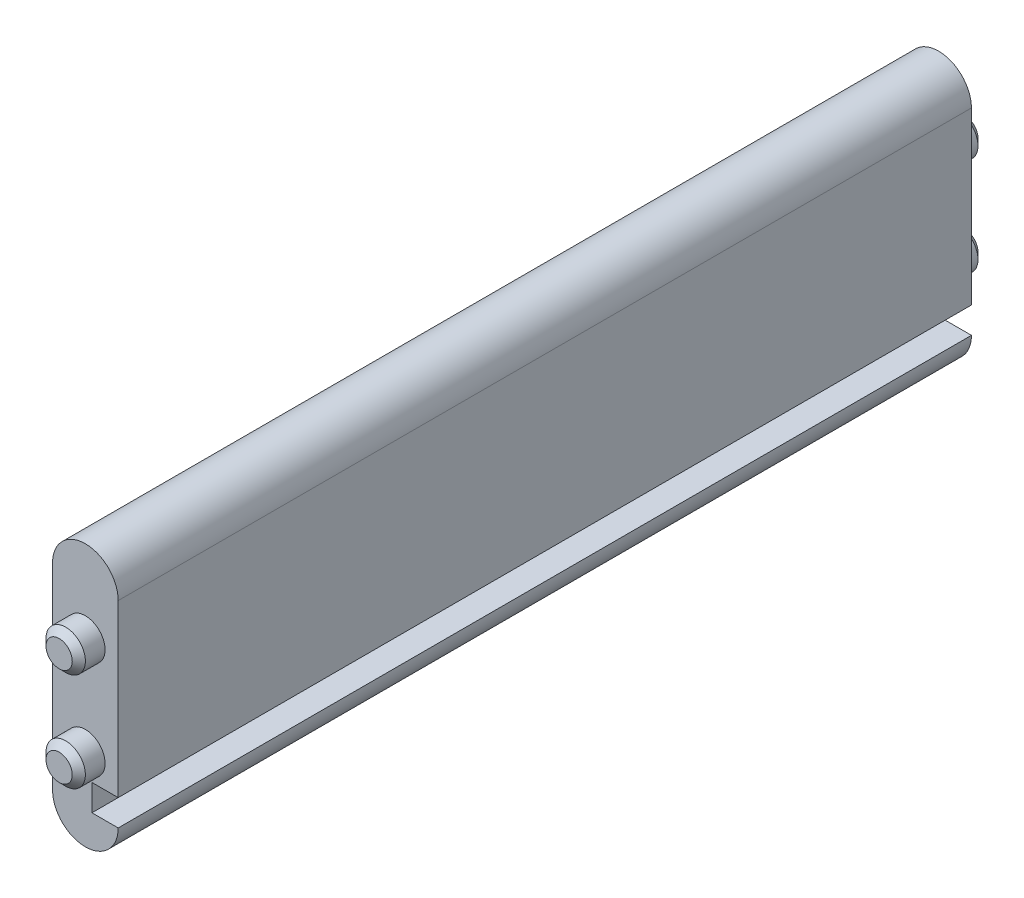
ISO-10303-21;
HEADER;
FILE_DESCRIPTION(('STEP AP214'),'2;1');
FILE_NAME('part.step','',(''),(''),'','','');
FILE_SCHEMA(('AUTOMOTIVE_DESIGN { 1 0 10303 214 1 1 1 1 }'));
ENDSEC;
DATA;
#1=APPLICATION_CONTEXT('core data for automotive mechanical design processes');
#2=APPLICATION_PROTOCOL_DEFINITION('international standard','automotive_design',2000,#1);
#3=PRODUCT_CONTEXT('',#1,'mechanical');
#4=PRODUCT('Part','Part','',(#3));
#5=PRODUCT_RELATED_PRODUCT_CATEGORY('part','',(#4));
#6=PRODUCT_DEFINITION_FORMATION('','',#4);
#7=PRODUCT_DEFINITION_CONTEXT('part definition',#1,'design');
#8=PRODUCT_DEFINITION('design','',#6,#7);
#9=PRODUCT_DEFINITION_SHAPE('','',#8);
#10=(LENGTH_UNIT() NAMED_UNIT(*) SI_UNIT(.MILLI.,.METRE.));
#11=(NAMED_UNIT(*) PLANE_ANGLE_UNIT() SI_UNIT($,.RADIAN.));
#12=(NAMED_UNIT(*) SI_UNIT($,.STERADIAN.) SOLID_ANGLE_UNIT());
#13=UNCERTAINTY_MEASURE_WITH_UNIT(LENGTH_MEASURE(1.E-05),#10,'distance_accuracy_value','');
#14=(GEOMETRIC_REPRESENTATION_CONTEXT(3) GLOBAL_UNCERTAINTY_ASSIGNED_CONTEXT((#13)) GLOBAL_UNIT_ASSIGNED_CONTEXT((#10,
#11,#12)) REPRESENTATION_CONTEXT('',''));
#15=CARTESIAN_POINT('',(0.,0.,0.));
#16=DIRECTION('',(0.,0.,1.));
#17=DIRECTION('',(1.,0.,0.));
#18=AXIS2_PLACEMENT_3D('',#15,#16,#17);
#19=CARTESIAN_POINT('',(0.,15.,65.));
#20=DIRECTION('',(0.,0.,-1.));
#21=DIRECTION('',(-1.,0.,0.));
#22=AXIS2_PLACEMENT_3D('',#19,#20,#21);
#23=PLANE('',#22);
#24=CARTESIAN_POINT('',(0.,7.5,65.));
#25=DIRECTION('',(0.,0.,-1.));
#26=DIRECTION('',(-1.,0.,0.));
#27=AXIS2_PLACEMENT_3D('',#24,#25,#26);
#28=CIRCLE('',#27,3.);
#29=CARTESIAN_POINT('',(-3.,7.5,65.));
#30=VERTEX_POINT('',#29);
#31=EDGE_CURVE('E146',#30,#30,#28,.F.);
#32=ORIENTED_EDGE('',*,*,#31,.F.);
#33=EDGE_LOOP('',(#32));
#34=FACE_BOUND('',#33,.T.);
#35=CARTESIAN_POINT('',(0.,15.,65.));
#36=DIRECTION('',(0.,0.,1.));
#37=DIRECTION('',(-1.,0.,0.));
#38=AXIS2_PLACEMENT_3D('',#35,#36,#37);
#39=CIRCLE('',#38,5.);
#40=CARTESIAN_POINT('',(5.,15.,65.));
#41=VERTEX_POINT('',#40);
#42=CARTESIAN_POINT('',(-5.,15.,65.));
#43=VERTEX_POINT('',#42);
#44=EDGE_CURVE('E134',#41,#43,#39,.T.);
#45=ORIENTED_EDGE('',*,*,#44,.T.);
#46=DIRECTION('',(0.,-1.,0.));
#47=VECTOR('',#46,1.);
#48=CARTESIAN_POINT('',(-5.,15.,65.));
#49=LINE('',#48,#47);
#50=CARTESIAN_POINT('',(-4.99999999999999,-15.,65.));
#51=VERTEX_POINT('',#50);
#52=EDGE_CURVE('E88',#43,#51,#49,.T.);
#53=ORIENTED_EDGE('',*,*,#52,.T.);
#54=CARTESIAN_POINT('',(0.,-15.,65.));
#55=DIRECTION('',(0.,0.,1.));
#56=DIRECTION('',(1.,0.,0.));
#57=AXIS2_PLACEMENT_3D('',#54,#55,#56);
#58=CIRCLE('',#57,5.);
#59=CARTESIAN_POINT('',(4.99999999999999,-15.,65.));
#60=VERTEX_POINT('',#59);
#61=EDGE_CURVE('E281',#51,#60,#58,.T.);
#62=ORIENTED_EDGE('',*,*,#61,.T.);
#63=DIRECTION('',(-1.,0.,0.));
#64=VECTOR('',#63,1.);
#65=CARTESIAN_POINT('',(5.00000000000001,-15.,65.));
#66=LINE('',#65,#64);
#67=CARTESIAN_POINT('',(0.999999999999997,-15.,65.));
#68=VERTEX_POINT('',#67);
#69=EDGE_CURVE('E104',#60,#68,#66,.T.);
#70=ORIENTED_EDGE('',*,*,#69,.T.);
#71=DIRECTION('',(0.,1.,0.));
#72=VECTOR('',#71,1.);
#73=CARTESIAN_POINT('',(0.999999999999997,-15.,65.));
#74=LINE('',#73,#72);
#75=CARTESIAN_POINT('',(0.999999999999997,-11.,65.));
#76=VERTEX_POINT('',#75);
#77=EDGE_CURVE('E98',#68,#76,#74,.T.);
#78=ORIENTED_EDGE('',*,*,#77,.T.);
#79=DIRECTION('',(1.,0.,0.));
#80=VECTOR('',#79,1.);
#81=CARTESIAN_POINT('',(5.,-11.,65.));
#82=LINE('',#81,#80);
#83=CARTESIAN_POINT('',(5.,-11.,65.));
#84=VERTEX_POINT('',#83);
#85=EDGE_CURVE('E102',#76,#84,#82,.T.);
#86=ORIENTED_EDGE('',*,*,#85,.T.);
#87=DIRECTION('',(0.,1.,0.));
#88=VECTOR('',#87,1.);
#89=CARTESIAN_POINT('',(5.,15.,65.));
#90=LINE('',#89,#88);
#91=EDGE_CURVE('E47',#84,#41,#90,.T.);
#92=ORIENTED_EDGE('',*,*,#91,.T.);
#93=EDGE_LOOP('',(#45,#53,#62,#70,#78,#86,#92));
#94=FACE_BOUND('',#93,.T.);
#95=CARTESIAN_POINT('',(0.,-7.5,65.));
#96=DIRECTION('',(0.,0.,-1.));
#97=DIRECTION('',(-1.,0.,0.));
#98=AXIS2_PLACEMENT_3D('',#95,#96,#97);
#99=CIRCLE('',#98,3.);
#100=CARTESIAN_POINT('',(-3.,-7.5,65.));
#101=VERTEX_POINT('',#100);
#102=EDGE_CURVE('E149',#101,#101,#99,.F.);
#103=ORIENTED_EDGE('',*,*,#102,.F.);
#104=EDGE_LOOP('',(#103));
#105=FACE_BOUND('',#104,.T.);
#106=ADVANCED_FACE('F30',(#34,#94,#105),#23,.F.);
#107=CARTESIAN_POINT('',(0.,15.,65.));
#108=DIRECTION('',(0.,0.,-1.));
#109=DIRECTION('',(-1.,0.,0.));
#110=AXIS2_PLACEMENT_3D('',#107,#108,#109);
#111=CYLINDRICAL_SURFACE('',#110,5.);
#112=CARTESIAN_POINT('',(0.,15.,-65.));
#113=DIRECTION('',(0.,0.,1.));
#114=DIRECTION('',(-1.,0.,0.));
#115=AXIS2_PLACEMENT_3D('',#112,#113,#114);
#116=CIRCLE('',#115,5.);
#117=CARTESIAN_POINT('',(5.,15.,-65.));
#118=VERTEX_POINT('',#117);
#119=CARTESIAN_POINT('',(-5.,15.,-65.));
#120=VERTEX_POINT('',#119);
#121=EDGE_CURVE('E122',#118,#120,#116,.T.);
#122=ORIENTED_EDGE('',*,*,#121,.T.);
#123=DIRECTION('',(0.,0.,-1.));
#124=VECTOR('',#123,1.);
#125=CARTESIAN_POINT('',(-5.,15.,65.));
#126=LINE('',#125,#124);
#127=EDGE_CURVE('E144',#43,#120,#126,.T.);
#128=ORIENTED_EDGE('',*,*,#127,.F.);
#129=ORIENTED_EDGE('',*,*,#44,.F.);
#130=DIRECTION('',(0.,0.,-1.));
#131=VECTOR('',#130,1.);
#132=CARTESIAN_POINT('',(5.,15.,65.));
#133=LINE('',#132,#131);
#134=EDGE_CURVE('E118',#41,#118,#133,.T.);
#135=ORIENTED_EDGE('',*,*,#134,.T.);
#136=EDGE_LOOP('',(#122,#128,#129,#135));
#137=FACE_BOUND('',#136,.T.);
#138=ADVANCED_FACE('F191',(#137),#111,.T.);
#139=CARTESIAN_POINT('',(-5.,15.,65.));
#140=DIRECTION('',(1.,0.,0.));
#141=DIRECTION('',(0.,1.,0.));
#142=AXIS2_PLACEMENT_3D('',#139,#140,#141);
#143=PLANE('',#142);
#144=DIRECTION('',(0.,-1.,0.));
#145=VECTOR('',#144,1.);
#146=CARTESIAN_POINT('',(-5.,15.,-65.));
#147=LINE('',#146,#145);
#148=CARTESIAN_POINT('',(-4.99999999999999,-15.,-65.));
#149=VERTEX_POINT('',#148);
#150=EDGE_CURVE('E125',#120,#149,#147,.T.);
#151=ORIENTED_EDGE('',*,*,#150,.T.);
#152=DIRECTION('',(0.,0.,-1.));
#153=VECTOR('',#152,1.);
#154=CARTESIAN_POINT('',(-4.99999999999999,-15.,65.));
#155=LINE('',#154,#153);
#156=EDGE_CURVE('E141',#51,#149,#155,.T.);
#157=ORIENTED_EDGE('',*,*,#156,.F.);
#158=ORIENTED_EDGE('',*,*,#52,.F.);
#159=ORIENTED_EDGE('',*,*,#127,.T.);
#160=EDGE_LOOP('',(#151,#157,#158,#159));
#161=FACE_BOUND('',#160,.T.);
#162=ADVANCED_FACE('F197',(#161),#143,.F.);
#163=CARTESIAN_POINT('',(0.,-15.,65.));
#164=DIRECTION('',(0.,0.,-1.));
#165=DIRECTION('',(-1.,0.,0.));
#166=AXIS2_PLACEMENT_3D('',#163,#164,#165);
#167=CYLINDRICAL_SURFACE('',#166,5.);
#168=CARTESIAN_POINT('',(0.,-15.,-65.));
#169=DIRECTION('',(0.,0.,1.));
#170=DIRECTION('',(1.,0.,0.));
#171=AXIS2_PLACEMENT_3D('',#168,#169,#170);
#172=CIRCLE('',#171,5.);
#173=CARTESIAN_POINT('',(4.99999999999999,-15.,-65.));
#174=VERTEX_POINT('',#173);
#175=EDGE_CURVE('E127',#149,#174,#172,.T.);
#176=ORIENTED_EDGE('',*,*,#175,.T.);
#177=DIRECTION('',(0.,0.,-1.));
#178=VECTOR('',#177,1.);
#179=CARTESIAN_POINT('',(4.99999999999999,-15.,65.));
#180=LINE('',#179,#178);
#181=EDGE_CURVE('E138',#60,#174,#180,.T.);
#182=ORIENTED_EDGE('',*,*,#181,.F.);
#183=ORIENTED_EDGE('',*,*,#61,.F.);
#184=ORIENTED_EDGE('',*,*,#156,.T.);
#185=EDGE_LOOP('',(#176,#182,#183,#184));
#186=FACE_BOUND('',#185,.T.);
#187=ADVANCED_FACE('F219',(#186),#167,.T.);
#188=CARTESIAN_POINT('',(5.00000000000001,-15.,65.));
#189=DIRECTION('',(0.,-1.,0.));
#190=DIRECTION('',(0.,0.,-1.));
#191=AXIS2_PLACEMENT_3D('',#188,#189,#190);
#192=PLANE('',#191);
#193=DIRECTION('',(-1.,0.,0.));
#194=VECTOR('',#193,1.);
#195=CARTESIAN_POINT('',(5.00000000000001,-15.,-65.));
#196=LINE('',#195,#194);
#197=CARTESIAN_POINT('',(0.999999999999997,-15.,-65.));
#198=VERTEX_POINT('',#197);
#199=EDGE_CURVE('E129',#174,#198,#196,.T.);
#200=ORIENTED_EDGE('',*,*,#199,.T.);
#201=DIRECTION('',(0.,0.,-1.));
#202=VECTOR('',#201,1.);
#203=CARTESIAN_POINT('',(0.999999999999997,-15.,65.));
#204=LINE('',#203,#202);
#205=EDGE_CURVE('E113',#68,#198,#204,.T.);
#206=ORIENTED_EDGE('',*,*,#205,.F.);
#207=ORIENTED_EDGE('',*,*,#69,.F.);
#208=ORIENTED_EDGE('',*,*,#181,.T.);
#209=EDGE_LOOP('',(#200,#206,#207,#208));
#210=FACE_BOUND('',#209,.T.);
#211=ADVANCED_FACE('F216',(#210),#192,.F.);
#212=CARTESIAN_POINT('',(0.999999999999997,-15.,65.));
#213=DIRECTION('',(-1.,0.,0.));
#214=DIRECTION('',(0.,0.,1.));
#215=AXIS2_PLACEMENT_3D('',#212,#213,#214);
#216=PLANE('',#215);
#217=DIRECTION('',(0.,1.,0.));
#218=VECTOR('',#217,1.);
#219=CARTESIAN_POINT('',(0.999999999999997,-15.,-65.));
#220=LINE('',#219,#218);
#221=CARTESIAN_POINT('',(0.999999999999997,-11.,-65.));
#222=VERTEX_POINT('',#221);
#223=EDGE_CURVE('E112',#198,#222,#220,.T.);
#224=ORIENTED_EDGE('',*,*,#223,.T.);
#225=DIRECTION('',(0.,0.,-1.));
#226=VECTOR('',#225,1.);
#227=CARTESIAN_POINT('',(0.999999999999997,-11.,65.));
#228=LINE('',#227,#226);
#229=EDGE_CURVE('E109',#76,#222,#228,.T.);
#230=ORIENTED_EDGE('',*,*,#229,.F.);
#231=ORIENTED_EDGE('',*,*,#77,.F.);
#232=ORIENTED_EDGE('',*,*,#205,.T.);
#233=EDGE_LOOP('',(#224,#230,#231,#232));
#234=FACE_BOUND('',#233,.T.);
#235=ADVANCED_FACE('F110',(#234),#216,.F.);
#236=CARTESIAN_POINT('',(5.,-11.,65.));
#237=DIRECTION('',(0.,1.,0.));
#238=DIRECTION('',(0.,0.,1.));
#239=AXIS2_PLACEMENT_3D('',#236,#237,#238);
#240=PLANE('',#239);
#241=DIRECTION('',(1.,0.,0.));
#242=VECTOR('',#241,1.);
#243=CARTESIAN_POINT('',(5.,-11.,-65.));
#244=LINE('',#243,#242);
#245=CARTESIAN_POINT('',(5.,-11.,-65.));
#246=VERTEX_POINT('',#245);
#247=EDGE_CURVE('E73',#222,#246,#244,.T.);
#248=ORIENTED_EDGE('',*,*,#247,.T.);
#249=DIRECTION('',(0.,0.,-1.));
#250=VECTOR('',#249,1.);
#251=CARTESIAN_POINT('',(5.,-11.,65.));
#252=LINE('',#251,#250);
#253=EDGE_CURVE('E114',#84,#246,#252,.T.);
#254=ORIENTED_EDGE('',*,*,#253,.F.);
#255=ORIENTED_EDGE('',*,*,#85,.F.);
#256=ORIENTED_EDGE('',*,*,#229,.T.);
#257=EDGE_LOOP('',(#248,#254,#255,#256));
#258=FACE_BOUND('',#257,.T.);
#259=ADVANCED_FACE('F116',(#258),#240,.F.);
#260=CARTESIAN_POINT('',(5.,15.,65.));
#261=DIRECTION('',(-1.,0.,0.));
#262=DIRECTION('',(0.,-1.,0.));
#263=AXIS2_PLACEMENT_3D('',#260,#261,#262);
#264=PLANE('',#263);
#265=DIRECTION('',(0.,1.,0.));
#266=VECTOR('',#265,1.);
#267=CARTESIAN_POINT('',(5.,15.,-65.));
#268=LINE('',#267,#266);
#269=EDGE_CURVE('E79',#246,#118,#268,.T.);
#270=ORIENTED_EDGE('',*,*,#269,.T.);
#271=ORIENTED_EDGE('',*,*,#134,.F.);
#272=ORIENTED_EDGE('',*,*,#91,.F.);
#273=ORIENTED_EDGE('',*,*,#253,.T.);
#274=EDGE_LOOP('',(#270,#271,#272,#273));
#275=FACE_BOUND('',#274,.T.);
#276=ADVANCED_FACE('F208',(#275),#264,.F.);
#277=CARTESIAN_POINT('',(0.,15.,-65.));
#278=DIRECTION('',(0.,0.,-1.));
#279=DIRECTION('',(-1.,0.,0.));
#280=AXIS2_PLACEMENT_3D('',#277,#278,#279);
#281=PLANE('',#280);
#282=CARTESIAN_POINT('',(0.,-7.5,-65.));
#283=DIRECTION('',(0.,0.,-1.));
#284=DIRECTION('',(-1.,0.,0.));
#285=AXIS2_PLACEMENT_3D('',#282,#283,#284);
#286=CIRCLE('',#285,3.);
#287=CARTESIAN_POINT('',(-3.,-7.5,-65.));
#288=VERTEX_POINT('',#287);
#289=EDGE_CURVE('E167',#288,#288,#286,.T.);
#290=ORIENTED_EDGE('',*,*,#289,.F.);
#291=EDGE_LOOP('',(#290));
#292=FACE_BOUND('',#291,.T.);
#293=CARTESIAN_POINT('',(0.,7.5,-65.));
#294=DIRECTION('',(0.,0.,-1.));
#295=DIRECTION('',(-1.,0.,0.));
#296=AXIS2_PLACEMENT_3D('',#293,#294,#295);
#297=CIRCLE('',#296,3.);
#298=CARTESIAN_POINT('',(-3.,7.5,-65.));
#299=VERTEX_POINT('',#298);
#300=EDGE_CURVE('E164',#299,#299,#297,.T.);
#301=ORIENTED_EDGE('',*,*,#300,.F.);
#302=EDGE_LOOP('',(#301));
#303=FACE_BOUND('',#302,.T.);
#304=ORIENTED_EDGE('',*,*,#121,.F.);
#305=ORIENTED_EDGE('',*,*,#269,.F.);
#306=ORIENTED_EDGE('',*,*,#247,.F.);
#307=ORIENTED_EDGE('',*,*,#223,.F.);
#308=ORIENTED_EDGE('',*,*,#199,.F.);
#309=ORIENTED_EDGE('',*,*,#175,.F.);
#310=ORIENTED_EDGE('',*,*,#150,.F.);
#311=EDGE_LOOP('',(#304,#305,#306,#307,#308,#309,#310));
#312=FACE_BOUND('',#311,.T.);
#313=ADVANCED_FACE('F205',(#292,#303,#312),#281,.T.);
#314=CARTESIAN_POINT('',(0.,7.5,69.));
#315=DIRECTION('',(0.,0.,-1.));
#316=DIRECTION('',(-1.,0.,0.));
#317=AXIS2_PLACEMENT_3D('',#314,#315,#316);
#318=CYLINDRICAL_SURFACE('',#317,3.);
#319=CARTESIAN_POINT('',(0.,7.5,68.));
#320=DIRECTION('',(0.,0.,1.));
#321=DIRECTION('',(1.,0.,0.));
#322=AXIS2_PLACEMENT_3D('',#319,#320,#321);
#323=CIRCLE('',#322,3.);
#324=CARTESIAN_POINT('',(3.,7.5,68.));
#325=VERTEX_POINT('',#324);
#326=EDGE_CURVE('E161',#325,#325,#323,.F.);
#327=ORIENTED_EDGE('',*,*,#326,.T.);
#328=EDGE_LOOP('',(#327));
#329=FACE_BOUND('',#328,.T.);
#330=ORIENTED_EDGE('',*,*,#31,.T.);
#331=EDGE_LOOP('',(#330));
#332=FACE_BOUND('',#331,.T.);
#333=ADVANCED_FACE('F203',(#329,#332),#318,.T.);
#334=CARTESIAN_POINT('',(0.,7.5,69.));
#335=DIRECTION('',(0.,0.,1.));
#336=DIRECTION('',(1.,0.,0.));
#337=AXIS2_PLACEMENT_3D('',#334,#335,#336);
#338=PLANE('',#337);
#339=CARTESIAN_POINT('',(0.,7.5,69.));
#340=DIRECTION('',(0.,0.,1.));
#341=DIRECTION('',(1.,0.,0.));
#342=AXIS2_PLACEMENT_3D('',#339,#340,#341);
#343=CIRCLE('',#342,1.99999999999997);
#344=CARTESIAN_POINT('',(1.99999999999997,7.5,69.));
#345=VERTEX_POINT('',#344);
#346=EDGE_CURVE('E158',#345,#345,#343,.T.);
#347=ORIENTED_EDGE('',*,*,#346,.T.);
#348=EDGE_LOOP('',(#347));
#349=FACE_BOUND('',#348,.T.);
#350=ADVANCED_FACE('F243',(#349),#338,.T.);
#351=CARTESIAN_POINT('',(0.,-7.5,69.));
#352=DIRECTION('',(0.,0.,-1.));
#353=DIRECTION('',(-1.,0.,0.));
#354=AXIS2_PLACEMENT_3D('',#351,#352,#353);
#355=CYLINDRICAL_SURFACE('',#354,3.);
#356=CARTESIAN_POINT('',(0.,-7.5,68.));
#357=DIRECTION('',(0.,0.,-1.));
#358=DIRECTION('',(-1.,0.,0.));
#359=AXIS2_PLACEMENT_3D('',#356,#357,#358);
#360=CIRCLE('',#359,3.);
#361=CARTESIAN_POINT('',(-3.,-7.5,68.));
#362=VERTEX_POINT('',#361);
#363=EDGE_CURVE('E155',#362,#362,#360,.T.);
#364=ORIENTED_EDGE('',*,*,#363,.T.);
#365=EDGE_LOOP('',(#364));
#366=FACE_BOUND('',#365,.T.);
#367=ORIENTED_EDGE('',*,*,#102,.T.);
#368=EDGE_LOOP('',(#367));
#369=FACE_BOUND('',#368,.T.);
#370=ADVANCED_FACE('F245',(#366,#369),#355,.T.);
#371=CARTESIAN_POINT('',(0.,-7.5,69.));
#372=DIRECTION('',(0.,0.,-1.));
#373=DIRECTION('',(-1.,0.,0.));
#374=AXIS2_PLACEMENT_3D('',#371,#372,#373);
#375=PLANE('',#374);
#376=CARTESIAN_POINT('',(0.,-7.5,69.));
#377=DIRECTION('',(0.,0.,-1.));
#378=DIRECTION('',(-1.,0.,0.));
#379=AXIS2_PLACEMENT_3D('',#376,#377,#378);
#380=CIRCLE('',#379,1.99999999999997);
#381=CARTESIAN_POINT('',(-1.99999999999997,-7.5,69.));
#382=VERTEX_POINT('',#381);
#383=EDGE_CURVE('E152',#382,#382,#380,.F.);
#384=ORIENTED_EDGE('',*,*,#383,.T.);
#385=EDGE_LOOP('',(#384));
#386=FACE_BOUND('',#385,.T.);
#387=ADVANCED_FACE('F230',(#386),#375,.F.);
#388=CARTESIAN_POINT('',(0.,-7.5,69.));
#389=DIRECTION('',(0.,0.,-1.));
#390=DIRECTION('',(-1.,0.,0.));
#391=AXIS2_PLACEMENT_3D('',#388,#389,#390);
#392=CONICAL_SURFACE('',#391,1.99999999999997,0.78539816339744);
#393=ORIENTED_EDGE('',*,*,#363,.F.);
#394=EDGE_LOOP('',(#393));
#395=FACE_BOUND('',#394,.T.);
#396=ORIENTED_EDGE('',*,*,#383,.F.);
#397=EDGE_LOOP('',(#396));
#398=FACE_BOUND('',#397,.T.);
#399=ADVANCED_FACE('F226',(#395,#398),#392,.T.);
#400=CARTESIAN_POINT('',(0.,7.5,69.));
#401=DIRECTION('',(0.,0.,-1.));
#402=DIRECTION('',(-1.,0.,0.));
#403=AXIS2_PLACEMENT_3D('',#400,#401,#402);
#404=CONICAL_SURFACE('',#403,1.99999999999997,0.78539816339744);
#405=ORIENTED_EDGE('',*,*,#326,.F.);
#406=EDGE_LOOP('',(#405));
#407=FACE_BOUND('',#406,.T.);
#408=ORIENTED_EDGE('',*,*,#346,.F.);
#409=EDGE_LOOP('',(#408));
#410=FACE_BOUND('',#409,.T.);
#411=ADVANCED_FACE('F229',(#407,#410),#404,.T.);
#412=CARTESIAN_POINT('',(0.,7.5,-69.));
#413=DIRECTION('',(0.,0.,1.));
#414=DIRECTION('',(1.,0.,0.));
#415=AXIS2_PLACEMENT_3D('',#412,#413,#414);
#416=CYLINDRICAL_SURFACE('',#415,3.);
#417=CARTESIAN_POINT('',(0.,7.5,-68.));
#418=DIRECTION('',(0.,0.,-1.));
#419=DIRECTION('',(-1.,0.,0.));
#420=AXIS2_PLACEMENT_3D('',#417,#418,#419);
#421=CIRCLE('',#420,3.);
#422=CARTESIAN_POINT('',(-3.,7.5,-68.));
#423=VERTEX_POINT('',#422);
#424=EDGE_CURVE('E39',#423,#423,#421,.F.);
#425=ORIENTED_EDGE('',*,*,#424,.T.);
#426=EDGE_LOOP('',(#425));
#427=FACE_BOUND('',#426,.T.);
#428=ORIENTED_EDGE('',*,*,#300,.T.);
#429=EDGE_LOOP('',(#428));
#430=FACE_BOUND('',#429,.T.);
#431=ADVANCED_FACE('F178',(#427,#430),#416,.T.);
#432=CARTESIAN_POINT('',(0.,7.5,-69.));
#433=DIRECTION('',(0.,0.,-1.));
#434=DIRECTION('',(1.,0.,0.));
#435=AXIS2_PLACEMENT_3D('',#432,#433,#434);
#436=PLANE('',#435);
#437=CARTESIAN_POINT('',(0.,7.5,-69.));
#438=DIRECTION('',(0.,0.,-1.));
#439=DIRECTION('',(-1.,0.,0.));
#440=AXIS2_PLACEMENT_3D('',#437,#438,#439);
#441=CIRCLE('',#440,1.99999999999999);
#442=CARTESIAN_POINT('',(-1.99999999999999,7.5,-69.));
#443=VERTEX_POINT('',#442);
#444=EDGE_CURVE('E11',#443,#443,#441,.T.);
#445=ORIENTED_EDGE('',*,*,#444,.T.);
#446=EDGE_LOOP('',(#445));
#447=FACE_BOUND('',#446,.T.);
#448=ADVANCED_FACE('F237',(#447),#436,.T.);
#449=CARTESIAN_POINT('',(0.,-7.5,-69.));
#450=DIRECTION('',(0.,0.,1.));
#451=DIRECTION('',(1.,0.,0.));
#452=AXIS2_PLACEMENT_3D('',#449,#450,#451);
#453=CYLINDRICAL_SURFACE('',#452,3.);
#454=CARTESIAN_POINT('',(0.,-7.5,-68.));
#455=DIRECTION('',(0.,0.,1.));
#456=DIRECTION('',(1.,0.,0.));
#457=AXIS2_PLACEMENT_3D('',#454,#455,#456);
#458=CIRCLE('',#457,3.);
#459=CARTESIAN_POINT('',(3.,-7.5,-68.));
#460=VERTEX_POINT('',#459);
#461=EDGE_CURVE('E170',#460,#460,#458,.T.);
#462=ORIENTED_EDGE('',*,*,#461,.T.);
#463=EDGE_LOOP('',(#462));
#464=FACE_BOUND('',#463,.T.);
#465=ORIENTED_EDGE('',*,*,#289,.T.);
#466=EDGE_LOOP('',(#465));
#467=FACE_BOUND('',#466,.T.);
#468=ADVANCED_FACE('F259',(#464,#467),#453,.T.);
#469=CARTESIAN_POINT('',(0.,-7.5,-69.));
#470=DIRECTION('',(0.,0.,1.));
#471=DIRECTION('',(-1.,0.,0.));
#472=AXIS2_PLACEMENT_3D('',#469,#470,#471);
#473=PLANE('',#472);
#474=CARTESIAN_POINT('',(0.,-7.5,-69.));
#475=DIRECTION('',(0.,0.,1.));
#476=DIRECTION('',(1.,0.,0.));
#477=AXIS2_PLACEMENT_3D('',#474,#475,#476);
#478=CIRCLE('',#477,1.99999999999999);
#479=CARTESIAN_POINT('',(1.99999999999999,-7.5,-69.));
#480=VERTEX_POINT('',#479);
#481=EDGE_CURVE('E173',#480,#480,#478,.F.);
#482=ORIENTED_EDGE('',*,*,#481,.T.);
#483=EDGE_LOOP('',(#482));
#484=FACE_BOUND('',#483,.T.);
#485=ADVANCED_FACE('F187',(#484),#473,.F.);
#486=CARTESIAN_POINT('',(0.,-7.5,-68.));
#487=DIRECTION('',(0.,0.,1.));
#488=DIRECTION('',(1.,0.,0.));
#489=AXIS2_PLACEMENT_3D('',#486,#487,#488);
#490=CONICAL_SURFACE('',#489,3.,0.785398163397445);
#491=ORIENTED_EDGE('',*,*,#481,.F.);
#492=EDGE_LOOP('',(#491));
#493=FACE_BOUND('',#492,.T.);
#494=ORIENTED_EDGE('',*,*,#461,.F.);
#495=EDGE_LOOP('',(#494));
#496=FACE_BOUND('',#495,.T.);
#497=ADVANCED_FACE('F182',(#493,#496),#490,.T.);
#498=CARTESIAN_POINT('',(0.,7.5,-68.));
#499=DIRECTION('',(0.,0.,1.));
#500=DIRECTION('',(1.,0.,0.));
#501=AXIS2_PLACEMENT_3D('',#498,#499,#500);
#502=CONICAL_SURFACE('',#501,3.,0.785398163397445);
#503=ORIENTED_EDGE('',*,*,#444,.F.);
#504=EDGE_LOOP('',(#503));
#505=FACE_BOUND('',#504,.T.);
#506=ORIENTED_EDGE('',*,*,#424,.F.);
#507=EDGE_LOOP('',(#506));
#508=FACE_BOUND('',#507,.T.);
#509=ADVANCED_FACE('F32',(#505,#508),#502,.T.);
#510=CLOSED_SHELL('',(#106,#138,#162,#187,#211,#235,#259,#276,#313,#333,#350,#370,#387,#399,
#411,#431,#448,#468,#485,#497,#509));
#511=MANIFOLD_SOLID_BREP('B2',#510);
#512=ADVANCED_BREP_SHAPE_REPRESENTATION('',(#18,#511),#14);
#513=SHAPE_DEFINITION_REPRESENTATION(#9,#512);
ENDSEC;
END-ISO-10303-21;
